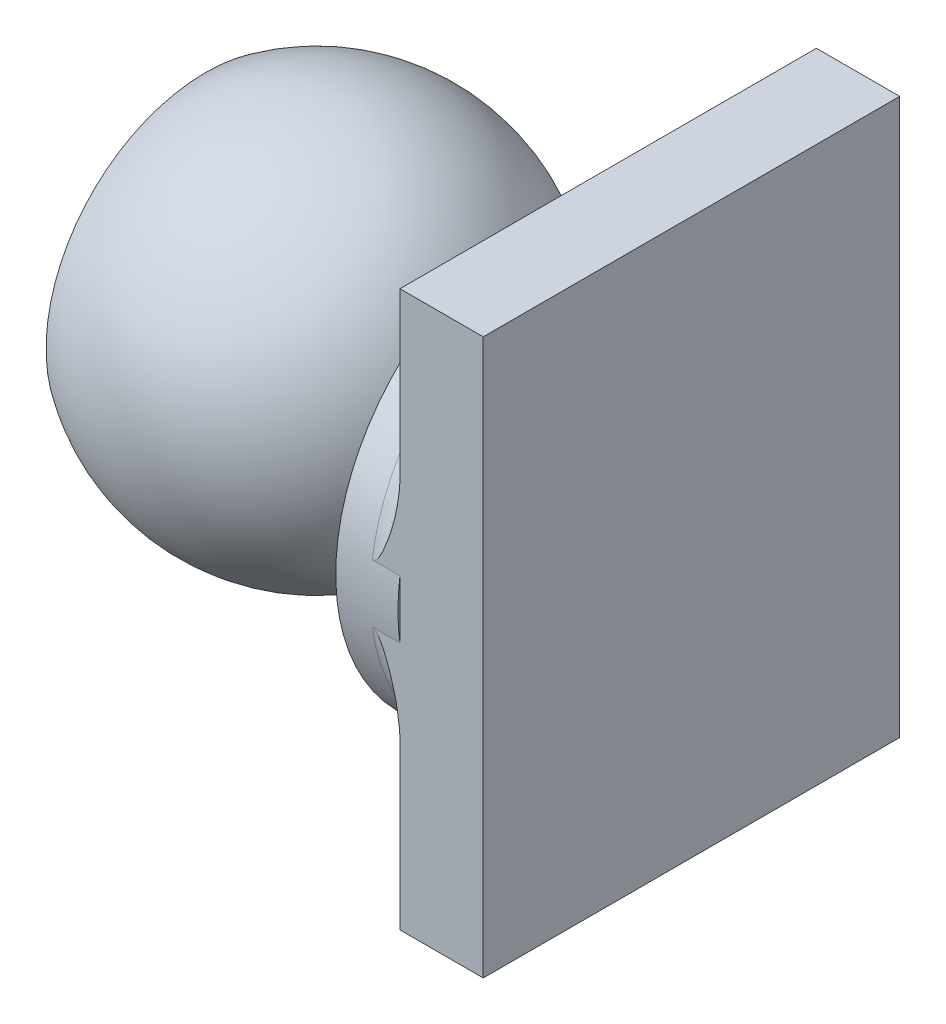
ISO-10303-21;
HEADER;
FILE_DESCRIPTION(('STEP AP214'),'2;1');
FILE_NAME('part.step','',(''),(''),'','','');
FILE_SCHEMA(('AUTOMOTIVE_DESIGN { 1 0 10303 214 1 1 1 1 }'));
ENDSEC;
DATA;
#1=APPLICATION_CONTEXT('core data for automotive mechanical design processes');
#2=APPLICATION_PROTOCOL_DEFINITION('international standard','automotive_design',2000,#1);
#3=PRODUCT_CONTEXT('',#1,'mechanical');
#4=PRODUCT('Part','Part','',(#3));
#5=PRODUCT_RELATED_PRODUCT_CATEGORY('part','',(#4));
#6=PRODUCT_DEFINITION_FORMATION('','',#4);
#7=PRODUCT_DEFINITION_CONTEXT('part definition',#1,'design');
#8=PRODUCT_DEFINITION('design','',#6,#7);
#9=PRODUCT_DEFINITION_SHAPE('','',#8);
#10=(LENGTH_UNIT() NAMED_UNIT(*) SI_UNIT(.MILLI.,.METRE.));
#11=(NAMED_UNIT(*) PLANE_ANGLE_UNIT() SI_UNIT($,.RADIAN.));
#12=(NAMED_UNIT(*) SI_UNIT($,.STERADIAN.) SOLID_ANGLE_UNIT());
#13=UNCERTAINTY_MEASURE_WITH_UNIT(LENGTH_MEASURE(1.E-05),#10,'distance_accuracy_value','');
#14=(GEOMETRIC_REPRESENTATION_CONTEXT(3) GLOBAL_UNCERTAINTY_ASSIGNED_CONTEXT((#13)) GLOBAL_UNIT_ASSIGNED_CONTEXT((#10,
#11,#12)) REPRESENTATION_CONTEXT('',''));
#15=CARTESIAN_POINT('',(0.,0.,0.));
#16=DIRECTION('',(0.,0.,1.));
#17=DIRECTION('',(1.,0.,0.));
#18=AXIS2_PLACEMENT_3D('',#15,#16,#17);
#19=CARTESIAN_POINT('',(3.5,0.,0.));
#20=DIRECTION('',(1.,0.,0.));
#21=DIRECTION('',(0.,1.,0.));
#22=AXIS2_PLACEMENT_3D('',#19,#20,#21);
#23=PLANE('',#22);
#24=DIRECTION('',(0.,1.,0.));
#25=VECTOR('',#24,1.);
#26=CARTESIAN_POINT('',(3.5,-10.,-7.5));
#27=LINE('',#26,#25);
#28=CARTESIAN_POINT('',(3.5,-1.04668366344204,-7.5));
#29=VERTEX_POINT('',#28);
#30=CARTESIAN_POINT('',(3.5,1.04668366344204,-7.5));
#31=VERTEX_POINT('',#30);
#32=EDGE_CURVE('E152',#29,#31,#27,.T.);
#33=ORIENTED_EDGE('',*,*,#32,.F.);
#34=CARTESIAN_POINT('',(3.5,0.,0.));
#35=DIRECTION('',(1.,0.,0.));
#36=DIRECTION('',(0.,1.,0.));
#37=AXIS2_PLACEMENT_3D('',#34,#35,#36);
#38=CIRCLE('',#37,7.57268424611224);
#39=EDGE_CURVE('E125',#29,#31,#38,.T.);
#40=ORIENTED_EDGE('',*,*,#39,.T.);
#41=EDGE_LOOP('',(#33,#40));
#42=FACE_BOUND('',#41,.T.);
#43=ADVANCED_FACE('F16',(#42),#23,.T.);
#44=CARTESIAN_POINT('',(-7.,0.,0.));
#45=DIRECTION('',(1.,0.,0.));
#46=DIRECTION('',(0.,-1.,0.));
#47=AXIS2_PLACEMENT_3D('',#44,#45,#46);
#48=SPHERICAL_SURFACE('',#47,7.);
#49=CARTESIAN_POINT('',(-0.625893910425168,0.,0.));
#50=DIRECTION('',(1.,0.,0.));
#51=DIRECTION('',(0.,1.,0.));
#52=AXIS2_PLACEMENT_3D('',#49,#50,#51);
#53=CIRCLE('',#52,2.89322857010037);
#54=CARTESIAN_POINT('',(-0.625893910425168,-2.89322857010037,0.));
#55=VERTEX_POINT('',#54);
#56=EDGE_CURVE('E144',#55,#55,#53,.T.);
#57=CARTESIAN_POINT('',(-11.,0.,0.));
#58=DIRECTION('',(1.,0.,0.));
#59=DIRECTION('',(0.,1.,0.));
#60=AXIS2_PLACEMENT_3D('',#57,#58,#59);
#61=CIRCLE('',#60,5.74456264653803);
#62=CARTESIAN_POINT('',(-11.,-5.74456264653803,0.));
#63=VERTEX_POINT('',#62);
#64=EDGE_CURVE('E141',#63,#63,#61,.T.);
#65=CARTESIAN_POINT('',(-0.625893910425168,-2.89322857010037,0.));
#66=CARTESIAN_POINT('',(-0.678720513837134,-3.00962059925854,0.));
#67=CARTESIAN_POINT('',(-0.734741613755756,-3.12456224260421,0.));
#68=CARTESIAN_POINT('',(-0.852990055992285,-3.35120758791202,0.));
#69=CARTESIAN_POINT('',(-0.915217398310191,-3.46291128987415,0.));
#70=CARTESIAN_POINT('',(-1.04569557473126,-3.68274358265632,0.));
#71=CARTESIAN_POINT('',(-1.11394640883443,-3.79087217347635,0.));
#72=CARTESIAN_POINT('',(-1.25626575846157,-4.00323040259294,0.));
#73=CARTESIAN_POINT('',(-1.33033427398554,-4.10746004088951,0.));
#74=CARTESIAN_POINT('',(-1.48406705952899,-4.31170752320604,0.));
#75=CARTESIAN_POINT('',(-1.56373132954847,-4.41172536722599,0.));
#76=CARTESIAN_POINT('',(-1.72841655141014,-4.60724924171603,0.));
#77=CARTESIAN_POINT('',(-1.81343750325235,-4.70275527218611,0.));
#78=CARTESIAN_POINT('',(-1.98858104173803,-4.88896898590638,0.));
#79=CARTESIAN_POINT('',(-2.07870362838151,-4.97967666915657,0.));
#80=CARTESIAN_POINT('',(-2.26378005856001,-5.1560215634769,0.));
#81=CARTESIAN_POINT('',(-2.35873390209502,-5.24165877454704,0.));
#82=CARTESIAN_POINT('',(-2.55318798101424,-5.40760580763381,0.));
#83=CARTESIAN_POINT('',(-2.65268821639844,-5.48791562965045,0.));
#84=CARTESIAN_POINT('',(-2.85593657271387,-5.64296695116595,0.));
#85=CARTESIAN_POINT('',(-2.9596846936451,-5.71770845066482,0.));
#86=CARTESIAN_POINT('',(-3.17111757136829,-5.86139889868131,0.));
#87=CARTESIAN_POINT('',(-3.27880232816025,-5.93034784719893,0.));
#88=CARTESIAN_POINT('',(-3.49778541767249,-6.0622463428146,0.));
#89=CARTESIAN_POINT('',(-3.60908375039277,-6.12519588991265,0.));
#90=CARTESIAN_POINT('',(-3.83496009094789,-6.24490673075047,0.));
#91=CARTESIAN_POINT('',(-3.94953809878274,-6.30166802449025,0.));
#92=CARTESIAN_POINT('',(-4.18163004954683,-6.40883207176162,0.));
#93=CARTESIAN_POINT('',(-4.29914399247606,-6.45923482529322,0.));
#94=CARTESIAN_POINT('',(-4.53675526545239,-6.55353058125031,0.));
#95=CARTESIAN_POINT('',(-4.65685259549947,-6.59742358367581,0.));
#96=CARTESIAN_POINT('',(-4.89927034443777,-6.67856815611704,0.));
#97=CARTESIAN_POINT('',(-5.02159076332898,-6.71581972613277,0.));
#98=CARTESIAN_POINT('',(-5.26808772229913,-6.7835696770954,0.));
#99=CARTESIAN_POINT('',(-5.39226426237807,-6.8140680580423,0.));
#100=CARTESIAN_POINT('',(-5.64210092760658,-6.86822013412881,0.));
#101=CARTESIAN_POINT('',(-5.76776105275615,-6.89187382926842,0.));
#102=CARTESIAN_POINT('',(-6.02018790117591,-6.93226557141724,0.));
#103=CARTESIAN_POINT('',(-6.14695462444609,-6.94900361842645,0.));
#104=CARTESIAN_POINT('',(-6.40121436230521,-6.97551384929822,0.));
#105=CARTESIAN_POINT('',(-6.52870737689414,-6.98528603316079,0.));
#106=CARTESIAN_POINT('',(-6.78403721167539,-6.99783522067448,0.));
#107=CARTESIAN_POINT('',(-6.91187403186771,-7.00061222432561,0.));
#108=CARTESIAN_POINT('',(-7.16750796071125,-6.9991627202674,0.));
#109=CARTESIAN_POINT('',(-7.29530506936247,-6.99493621255805,0.));
#110=CARTESIAN_POINT('',(-7.55047617709495,-6.97949236549626,0.));
#111=CARTESIAN_POINT('',(-7.67785017617622,-6.96827502614381,0.));
#112=CARTESIAN_POINT('',(-7.93179293616937,-6.93888316850108,0.));
#113=CARTESIAN_POINT('',(-8.05836169708125,-6.92070865021079,0.));
#114=CARTESIAN_POINT('',(-8.31031426759956,-6.87745695882374,0.));
#115=CARTESIAN_POINT('',(-8.43569807720598,-6.85237978572698,0.));
#116=CARTESIAN_POINT('',(-8.68490458798784,-6.79539801895556,0.));
#117=CARTESIAN_POINT('',(-8.80872728916329,-6.7634934252809,0.));
#118=CARTESIAN_POINT('',(-9.05444010527926,-6.69295252758927,0.));
#119=CARTESIAN_POINT('',(-9.17633022021979,-6.6543162235723,0.));
#120=CARTESIAN_POINT('',(-9.41781219916878,-6.57042783559098,0.));
#121=CARTESIAN_POINT('',(-9.53740406317724,-6.52517575162664,0.));
#122=CARTESIAN_POINT('',(-9.77393071353546,-6.42819148973891,0.));
#123=CARTESIAN_POINT('',(-9.89086549988521,-6.37645931181553,0.));
#124=CARTESIAN_POINT('',(-10.1217273519346,-6.26667033231316,0.));
#125=CARTESIAN_POINT('',(-10.2356544176342,-6.20861353073418,0.));
#126=CARTESIAN_POINT('',(-10.4601584161608,-6.08634846574174,0.));
#127=CARTESIAN_POINT('',(-10.5707353489877,-6.02214020232826,0.));
#128=CARTESIAN_POINT('',(-10.7882096779587,-5.88776861723792,0.));
#129=CARTESIAN_POINT('',(-10.8951070741027,-5.81760529556105,0.));
#130=CARTESIAN_POINT('',(-11.,-5.74456264653803,0.));
#131=B_SPLINE_CURVE_WITH_KNOTS('',3,(#65,#66,#67,#68,#69,#70,#71,#72,#73,#74,#75,#76,#77,#78,
#79,#80,#81,#82,#83,#84,#85,#86,#87,#88,#89,#90,#91,#92,#93,#94,#95,#96,#97,#98,#99,#100,#101,
#102,#103,#104,#105,#106,#107,#108,#109,#110,#111,#112,#113,#114,#115,#116,#117,#118,#119,#120,
#121,#122,#123,#124,#125,#126,#127,#128,#129,#130),.UNSPECIFIED.,.F.,.F.,(4,2,2,2,2,2,2,2,2,2,2,
2,2,2,2,2,2,2,2,2,2,2,2,2,2,2,2,2,2,2,2,2,4),(0.,0.383409133512161,0.766818267024323,
1.15022740053648,1.53363653404865,1.91704566756081,2.30045480107297,2.68386393458513,
3.06727306809729,3.45068220160945,3.83409133512161,4.21750046863378,4.60090960214594,
4.9843187356581,5.36772786917026,5.75113700268242,6.13454613619458,6.51795526970675,
6.90136440321891,7.28477353673107,7.66818267024323,8.05159180375539,8.43500093726755,
8.81841007077972,9.20181920429188,9.58522833780404,9.9686374713162,10.3520466048284,
10.7354557383405,11.1188648718527,11.5022740053648,11.885683138877,12.2690922723892),.UNSPECIFIED.);
#132=EDGE_CURVE('BSEAM188',#55,#63,#131,.T.);
#133=ORIENTED_EDGE('',*,*,#56,.F.);
#134=ORIENTED_EDGE('',*,*,#64,.T.);
#135=ORIENTED_EDGE('',*,*,#132,.T.);
#136=ORIENTED_EDGE('',*,*,#132,.F.);
#137=EDGE_LOOP('',(#133,#135,#134,#136));
#138=FACE_BOUND('',#137,.T.);
#139=ADVANCED_FACE('F188',(#138),#48,.T.);
#140=CARTESIAN_POINT('',(-11.,5.74456264653803,0.));
#141=DIRECTION('',(-1.,0.,0.));
#142=DIRECTION('',(0.,-1.,0.));
#143=AXIS2_PLACEMENT_3D('',#140,#141,#142);
#144=PLANE('',#143);
#145=CARTESIAN_POINT('',(-11.,0.,0.));
#146=DIRECTION('',(-1.,0.,0.));
#147=DIRECTION('',(0.,-1.,0.));
#148=AXIS2_PLACEMENT_3D('',#145,#146,#147);
#149=CIRCLE('',#148,5.1234753829798);
#150=CARTESIAN_POINT('',(-11.,-5.1234753829798,0.));
#151=VERTEX_POINT('',#150);
#152=EDGE_CURVE('E138',#151,#151,#149,.F.);
#153=ORIENTED_EDGE('',*,*,#152,.T.);
#154=EDGE_LOOP('',(#153));
#155=FACE_BOUND('',#154,.T.);
#156=ORIENTED_EDGE('',*,*,#64,.F.);
#157=EDGE_LOOP('',(#156));
#158=FACE_BOUND('',#157,.T.);
#159=ADVANCED_FACE('F192',(#155,#158),#144,.T.);
#160=CARTESIAN_POINT('',(-7.,0.,0.));
#161=DIRECTION('',(1.,0.,0.));
#162=DIRECTION('',(0.,-1.,0.));
#163=AXIS2_PLACEMENT_3D('',#160,#161,#162);
#164=SPHERICAL_SURFACE('',#163,6.5);
#165=ORIENTED_EDGE('',*,*,#152,.F.);
#166=EDGE_LOOP('',(#165));
#167=FACE_BOUND('',#166,.T.);
#168=ADVANCED_FACE('F196',(#167),#164,.F.);
#169=CARTESIAN_POINT('',(-11.5113796526032,0.,0.));
#170=DIRECTION('',(1.,0.,0.));
#171=DIRECTION('',(0.,1.,0.));
#172=AXIS2_PLACEMENT_3D('',#169,#170,#171);
#173=DEGENERATE_TOROIDAL_SURFACE('',#172,10.,13.,.T.);
#174=ORIENTED_EDGE('',*,*,#56,.T.);
#175=EDGE_LOOP('',(#174));
#176=FACE_BOUND('',#175,.T.);
#177=CARTESIAN_POINT('',(1.26,0.,0.));
#178=DIRECTION('',(1.,0.,0.));
#179=DIRECTION('',(0.,1.,0.));
#180=AXIS2_PLACEMENT_3D('',#177,#178,#179);
#181=CIRCLE('',#180,7.57268424611224);
#182=CARTESIAN_POINT('',(1.26,7.57268424611224,0.));
#183=VERTEX_POINT('',#182);
#184=EDGE_CURVE('E135',#183,#183,#181,.T.);
#185=ORIENTED_EDGE('',*,*,#184,.F.);
#186=EDGE_LOOP('',(#185));
#187=FACE_BOUND('',#186,.T.);
#188=ADVANCED_FACE('F200',(#176,#187),#173,.F.);
#189=CARTESIAN_POINT('',(-11.,0.,0.));
#190=DIRECTION('',(1.,0.,0.));
#191=DIRECTION('',(0.,1.,0.));
#192=AXIS2_PLACEMENT_3D('',#189,#190,#191);
#193=CYLINDRICAL_SURFACE('',#192,7.57268424611224);
#194=ORIENTED_EDGE('',*,*,#184,.T.);
#195=EDGE_LOOP('',(#194));
#196=FACE_BOUND('',#195,.T.);
#197=ORIENTED_EDGE('',*,*,#39,.F.);
#198=DIRECTION('',(1.,0.,0.));
#199=VECTOR('',#198,1.);
#200=CARTESIAN_POINT('',(3.5,-1.04668366344204,-7.5));
#201=LINE('',#200,#199);
#202=CARTESIAN_POINT('',(2.5,-1.04668366344204,-7.5));
#203=VERTEX_POINT('',#202);
#204=EDGE_CURVE('E45',#29,#203,#201,.F.);
#205=ORIENTED_EDGE('',*,*,#204,.T.);
#206=CARTESIAN_POINT('',(2.5,0.,0.));
#207=DIRECTION('',(-1.,0.,0.));
#208=DIRECTION('',(0.,-1.,0.));
#209=AXIS2_PLACEMENT_3D('',#206,#207,#208);
#210=CIRCLE('',#209,7.57268424611224);
#211=CARTESIAN_POINT('',(2.5,-1.04668366344206,7.5));
#212=VERTEX_POINT('',#211);
#213=EDGE_CURVE('E160',#203,#212,#210,.T.);
#214=ORIENTED_EDGE('',*,*,#213,.T.);
#215=DIRECTION('',(1.,0.,0.));
#216=VECTOR('',#215,1.);
#217=CARTESIAN_POINT('',(2.5,-1.04668366344206,7.5));
#218=LINE('',#217,#216);
#219=CARTESIAN_POINT('',(3.5,-1.04668366344206,7.5));
#220=VERTEX_POINT('',#219);
#221=EDGE_CURVE('E158',#212,#220,#218,.T.);
#222=ORIENTED_EDGE('',*,*,#221,.T.);
#223=CARTESIAN_POINT('',(3.5,1.04668366344206,7.5));
#224=VERTEX_POINT('',#223);
#225=EDGE_CURVE('E128',#224,#220,#38,.T.);
#226=ORIENTED_EDGE('',*,*,#225,.F.);
#227=DIRECTION('',(1.,0.,0.));
#228=VECTOR('',#227,1.);
#229=CARTESIAN_POINT('',(3.5,1.04668366344206,7.5));
#230=LINE('',#229,#228);
#231=CARTESIAN_POINT('',(2.5,1.04668366344206,7.5));
#232=VERTEX_POINT('',#231);
#233=EDGE_CURVE('E37',#224,#232,#230,.F.);
#234=ORIENTED_EDGE('',*,*,#233,.T.);
#235=CARTESIAN_POINT('',(2.5,0.,0.));
#236=DIRECTION('',(-1.,0.,0.));
#237=DIRECTION('',(0.,-1.,0.));
#238=AXIS2_PLACEMENT_3D('',#235,#236,#237);
#239=CIRCLE('',#238,7.57268424611224);
#240=CARTESIAN_POINT('',(2.5,1.04668366344204,-7.5));
#241=VERTEX_POINT('',#240);
#242=EDGE_CURVE('E154',#232,#241,#239,.T.);
#243=ORIENTED_EDGE('',*,*,#242,.T.);
#244=DIRECTION('',(1.,0.,0.));
#245=VECTOR('',#244,1.);
#246=CARTESIAN_POINT('',(2.5,1.04668366344204,-7.5));
#247=LINE('',#246,#245);
#248=EDGE_CURVE('E151',#241,#31,#247,.T.);
#249=ORIENTED_EDGE('',*,*,#248,.T.);
#250=EDGE_LOOP('',(#197,#205,#214,#222,#226,#234,#243,#249));
#251=FACE_BOUND('',#250,.T.);
#252=ADVANCED_FACE('F204',(#196,#251),#193,.T.);
#253=DIRECTION('',(0.,-1.,0.));
#254=VECTOR('',#253,1.);
#255=CARTESIAN_POINT('',(3.5,-10.,7.5));
#256=LINE('',#255,#254);
#257=EDGE_CURVE('E147',#224,#220,#256,.T.);
#258=ORIENTED_EDGE('',*,*,#257,.F.);
#259=ORIENTED_EDGE('',*,*,#225,.T.);
#260=EDGE_LOOP('',(#258,#259));
#261=FACE_BOUND('',#260,.T.);
#262=ADVANCED_FACE('F207',(#261),#23,.T.);
#263=CARTESIAN_POINT('',(3.5,0.,0.));
#264=DIRECTION('',(-1.,0.,0.));
#265=DIRECTION('',(0.,-1.,0.));
#266=AXIS2_PLACEMENT_3D('',#263,#264,#265);
#267=PLANE('',#266);
#268=CARTESIAN_POINT('',(3.5,-4.15221810404282,7.5));
#269=VERTEX_POINT('',#268);
#270=CARTESIAN_POINT('',(3.5,-10.,7.5));
#271=VERTEX_POINT('',#270);
#272=EDGE_CURVE('E231',#269,#271,#256,.T.);
#273=ORIENTED_EDGE('',*,*,#272,.F.);
#274=CARTESIAN_POINT('',(3.5,0.,0.));
#275=DIRECTION('',(-1.,0.,0.));
#276=DIRECTION('',(0.,-1.,0.));
#277=AXIS2_PLACEMENT_3D('',#274,#275,#276);
#278=CIRCLE('',#277,8.57268424611224);
#279=CARTESIAN_POINT('',(3.5,-4.15221810404281,-7.5));
#280=VERTEX_POINT('',#279);
#281=EDGE_CURVE('E148',#269,#280,#278,.F.);
#282=ORIENTED_EDGE('',*,*,#281,.T.);
#283=CARTESIAN_POINT('',(3.5,-10.,-7.5));
#284=VERTEX_POINT('',#283);
#285=EDGE_CURVE('E228',#284,#280,#27,.T.);
#286=ORIENTED_EDGE('',*,*,#285,.F.);
#287=DIRECTION('',(0.,0.,-1.));
#288=VECTOR('',#287,1.);
#289=CARTESIAN_POINT('',(3.5,-10.,7.5));
#290=LINE('',#289,#288);
#291=EDGE_CURVE('E118',#271,#284,#290,.T.);
#292=ORIENTED_EDGE('',*,*,#291,.F.);
#293=EDGE_LOOP('',(#273,#282,#286,#292));
#294=FACE_BOUND('',#293,.T.);
#295=ADVANCED_FACE('F210',(#294),#267,.T.);
#296=CARTESIAN_POINT('',(6.5,-10.,-7.5));
#297=DIRECTION('',(0.,0.,1.));
#298=DIRECTION('',(1.,0.,0.));
#299=AXIS2_PLACEMENT_3D('',#296,#297,#298);
#300=PLANE('',#299);
#301=ORIENTED_EDGE('',*,*,#285,.T.);
#302=CARTESIAN_POINT('',(3.5,-4.15221810404281,-7.5));
#303=CARTESIAN_POINT('',(3.49998602585192,-4.07619579044968,-7.5));
#304=CARTESIAN_POINT('',(3.49796690258575,-4.00019552069111,-7.5));
#305=CARTESIAN_POINT('',(3.49032557481961,-3.84841051982147,-7.5));
#306=CARTESIAN_POINT('',(3.48470513667468,-3.77262570133002,-7.5));
#307=CARTESIAN_POINT('',(3.47027829481186,-3.62148045349341,-7.5));
#308=CARTESIAN_POINT('',(3.46147662918391,-3.54611956139317,-7.5));
#309=CARTESIAN_POINT('',(3.44100197833614,-3.39578328651817,-7.5));
#310=CARTESIAN_POINT('',(3.42932859895472,-3.320807958108,-7.5));
#311=CARTESIAN_POINT('',(3.39049919530744,-3.09702986013956,-7.5));
#312=CARTESIAN_POINT('',(3.35948390541665,-2.94888941892457,-7.5));
#313=CARTESIAN_POINT('',(3.28873234310775,-2.65470467569145,-7.5));
#314=CARTESIAN_POINT('',(3.24899431701207,-2.50866080148067,-7.5));
#315=CARTESIAN_POINT('',(3.18077945003938,-2.28297239525335,-7.5));
#316=CARTESIAN_POINT('',(3.15507643986649,-2.20247927776013,-7.5));
#317=CARTESIAN_POINT('',(3.10107093080022,-2.04237821522817,-7.5));
#318=CARTESIAN_POINT('',(3.07276888945103,-1.96277011714274,-7.5));
#319=CARTESIAN_POINT('',(3.0227135749947,-1.8299120681365,-7.5));
#320=CARTESIAN_POINT('',(3.00175488675105,-1.77636250834128,-7.5));
#321=CARTESIAN_POINT('',(2.95820216839895,-1.66993571322519,-7.5));
#322=CARTESIAN_POINT('',(2.93560835781915,-1.61705838876776,-7.5));
#323=CARTESIAN_POINT('',(2.89592758732802,-1.52921711396469,-7.5));
#324=CARTESIAN_POINT('',(2.8794240668085,-1.49399265591849,-7.5));
#325=CARTESIAN_POINT('',(2.84513583041643,-1.42422341561753,-7.5));
#326=CARTESIAN_POINT('',(2.82735231162264,-1.38967803580789,-7.5));
#327=CARTESIAN_POINT('',(2.78332606571215,-1.3092317541726,-7.5));
#328=CARTESIAN_POINT('',(2.75633849892161,-1.26370664537015,-7.5));
#329=CARTESIAN_POINT('',(2.71077234488167,-1.19785827797504,-7.5));
#330=CARTESIAN_POINT('',(2.69443735223194,-1.17599284903538,-7.5));
#331=CARTESIAN_POINT('',(2.65922573376918,-1.13439156076557,-7.5));
#332=CARTESIAN_POINT('',(2.64036122730068,-1.11464630924515,-7.5));
#333=CARTESIAN_POINT('',(2.61113868826713,-1.09038536858632,-7.5));
#334=CARTESIAN_POINT('',(2.60248702284684,-1.08385164670882,-7.5));
#335=CARTESIAN_POINT('',(2.58441635762723,-1.07192642457945,-7.5));
#336=CARTESIAN_POINT('',(2.57499806004413,-1.06653389496831,-7.5));
#337=CARTESIAN_POINT('',(2.55729044222762,-1.05828321289377,-7.5));
#338=CARTESIAN_POINT('',(2.54913831372899,-1.05513604215696,-7.5));
#339=CARTESIAN_POINT('',(2.53243397061373,-1.05023788940225,-7.5));
#340=CARTESIAN_POINT('',(2.52388307951087,-1.04848259446262,-7.5));
#341=CARTESIAN_POINT('',(2.51018620323898,-1.04696278890831,-7.5));
#342=CARTESIAN_POINT('',(2.50509419622608,-1.04667523440866,-7.5));
#343=CARTESIAN_POINT('',(2.5,-1.04668366344208,-7.5));
#344=B_SPLINE_CURVE_WITH_KNOTS('',3,(#302,#303,#304,#305,#306,#307,#308,#309,#310,#311,#312,
#313,#314,#315,#316,#317,#318,#319,#320,#321,#322,#323,#324,#325,#326,#327,#328,#329,#330,#331,
#332,#333,#334,#335,#336,#337,#338,#339,#340,#341,#342,#343),.UNSPECIFIED.,.F.,.F.,(4,2,2,2,2,2,
2,2,2,2,2,2,2,2,2,2,2,2,2,2,4),(0.,0.228008865198607,0.455905983256454,0.683465062855094,
0.911055393877772,1.36477511347286,1.81858613561742,2.07204304792123,2.32545542584803,
2.49795008782082,2.67042163377484,2.78709082771679,2.90365229368714,3.06206090625099,
3.14387544414527,3.22531113784945,3.25777594791488,3.29021134860758,3.31633190961825,
3.34237121263808,3.35764428545047),.UNSPECIFIED.);
#345=EDGE_CURVE('E167',#280,#203,#344,.T.);
#346=ORIENTED_EDGE('',*,*,#345,.T.);
#347=ORIENTED_EDGE('',*,*,#204,.F.);
#348=ORIENTED_EDGE('',*,*,#32,.T.);
#349=ORIENTED_EDGE('',*,*,#248,.F.);
#350=CARTESIAN_POINT('',(2.5,1.04668366344204,-7.5));
#351=CARTESIAN_POINT('',(2.50916212348161,1.04665001558555,-7.5));
#352=CARTESIAN_POINT('',(2.51827265365203,1.04759325552513,-7.5));
#353=CARTESIAN_POINT('',(2.53602510694833,1.05110080177459,-7.5));
#354=CARTESIAN_POINT('',(2.54467232725173,1.05363764923506,-7.5));
#355=CARTESIAN_POINT('',(2.56430804357991,1.0611042716994,-7.5));
#356=CARTESIAN_POINT('',(2.57509261561134,1.06655444645507,-7.5));
#357=CARTESIAN_POINT('',(2.59575117114504,1.0790628045957,-7.5));
#358=CARTESIAN_POINT('',(2.60561761228421,1.08613289258697,-7.5));
#359=CARTESIAN_POINT('',(2.63908559131765,1.11295152545352,-7.5));
#360=CARTESIAN_POINT('',(2.66042210123204,1.13544773387831,-7.5));
#361=CARTESIAN_POINT('',(2.70000575914009,1.18298576511521,-7.5));
#362=CARTESIAN_POINT('',(2.71823154176116,1.20804343983578,-7.5));
#363=CARTESIAN_POINT('',(2.75358406895373,1.26081344015133,-7.5));
#364=CARTESIAN_POINT('',(2.77060656445203,1.28859600256456,-7.5));
#365=CARTESIAN_POINT('',(2.80317795473258,1.345018908314,-7.5));
#366=CARTESIAN_POINT('',(2.81872554780449,1.37365998054827,-7.5));
#367=CARTESIAN_POINT('',(2.86384644506877,1.46052711897878,-7.5));
#368=CARTESIAN_POINT('',(2.89182508723849,1.51957895144373,-7.5));
#369=CARTESIAN_POINT('',(2.9452037648885,1.63900509513721,-7.5));
#370=CARTESIAN_POINT('',(2.97059618977094,1.69938270812543,-7.5));
#371=CARTESIAN_POINT('',(3.01932490224354,1.82087505152409,-7.5));
#372=CARTESIAN_POINT('',(3.04266365304079,1.88198879610447,-7.5));
#373=CARTESIAN_POINT('',(3.09816405710966,2.03355710302849,-7.5));
#374=CARTESIAN_POINT('',(3.12934836063497,2.1243690829884,-7.5));
#375=CARTESIAN_POINT('',(3.18843748693465,2.30706372279117,-7.5));
#376=CARTESIAN_POINT('',(3.21634183579313,2.3989465352541,-7.5));
#377=CARTESIAN_POINT('',(3.26886941224846,2.58370423234554,-7.5));
#378=CARTESIAN_POINT('',(3.29349074204254,2.67657965755368,-7.5));
#379=CARTESIAN_POINT('',(3.3392275988728,2.86318885427796,-7.5));
#380=CARTESIAN_POINT('',(3.36034327426913,2.95692258929299,-7.5));
#381=CARTESIAN_POINT('',(3.39799910860471,3.14163273997226,-7.5));
#382=CARTESIAN_POINT('',(3.41468171503674,3.23257993860565,-7.5));
#383=CARTESIAN_POINT('',(3.44405525822699,3.41510197449994,-7.5));
#384=CARTESIAN_POINT('',(3.45674704254346,3.50667667426713,-7.5));
#385=CARTESIAN_POINT('',(3.47762686508688,3.69038215708517,-7.5));
#386=CARTESIAN_POINT('',(3.48581348970603,3.78251310551615,-7.5));
#387=CARTESIAN_POINT('',(3.49698723893784,3.96715368266706,-7.5));
#388=CARTESIAN_POINT('',(3.49997040570137,4.05966354603787,-7.5));
#389=CARTESIAN_POINT('',(3.5,4.15221810404281,-7.5));
#390=B_SPLINE_CURVE_WITH_KNOTS('',3,(#350,#351,#352,#353,#354,#355,#356,#357,#358,#359,#360,
#361,#362,#363,#364,#365,#366,#367,#368,#369,#370,#371,#372,#373,#374,#375,#376,#377,#378,#379,
#380,#381,#382,#383,#384,#385,#386,#387,#388,#389),.UNSPECIFIED.,.F.,.F.,(4,2,2,2,2,2,2,2,2,2,2,
2,2,2,2,2,2,2,2,4),(0.,0.027355378285729,0.0542518695588779,0.090295744335143,0.126613518122659,
0.218899511780234,0.311795856733867,0.409454773965798,0.507199095775759,0.703102891230315,
0.899567467152857,1.09579309380254,1.38377271708995,1.67179389912061,1.95998086129607,
2.24815562421911,2.5254698667869,2.80272517438682,3.08006742831985,3.35762054221317),.UNSPECIFIED.);
#391=CARTESIAN_POINT('',(3.5,4.15221810404281,-7.5));
#392=VERTEX_POINT('',#391);
#393=EDGE_CURVE('E10',#241,#392,#390,.T.);
#394=ORIENTED_EDGE('',*,*,#393,.T.);
#395=CARTESIAN_POINT('',(3.5,10.,-7.5));
#396=VERTEX_POINT('',#395);
#397=EDGE_CURVE('E123',#392,#396,#27,.T.);
#398=ORIENTED_EDGE('',*,*,#397,.T.);
#399=DIRECTION('',(-1.,0.,0.));
#400=VECTOR('',#399,1.);
#401=CARTESIAN_POINT('',(6.5,10.,-7.5));
#402=LINE('',#401,#400);
#403=CARTESIAN_POINT('',(6.5,10.,-7.5));
#404=VERTEX_POINT('',#403);
#405=EDGE_CURVE('E104',#404,#396,#402,.T.);
#406=ORIENTED_EDGE('',*,*,#405,.F.);
#407=DIRECTION('',(0.,1.,0.));
#408=VECTOR('',#407,1.);
#409=CARTESIAN_POINT('',(6.5,-10.,-7.5));
#410=LINE('',#409,#408);
#411=CARTESIAN_POINT('',(6.5,-10.,-7.5));
#412=VERTEX_POINT('',#411);
#413=EDGE_CURVE('E110',#412,#404,#410,.T.);
#414=ORIENTED_EDGE('',*,*,#413,.F.);
#415=DIRECTION('',(-1.,0.,0.));
#416=VECTOR('',#415,1.);
#417=CARTESIAN_POINT('',(6.5,-10.,-7.5));
#418=LINE('',#417,#416);
#419=EDGE_CURVE('E239',#412,#284,#418,.T.);
#420=ORIENTED_EDGE('',*,*,#419,.T.);
#421=EDGE_LOOP('',(#301,#346,#347,#348,#349,#394,#398,#406,#414,#420));
#422=FACE_BOUND('',#421,.T.);
#423=ADVANCED_FACE('F121',(#422),#300,.F.);
#424=CARTESIAN_POINT('',(6.5,10.,7.5));
#425=DIRECTION('',(0.,-1.,0.));
#426=DIRECTION('',(1.,0.,0.));
#427=AXIS2_PLACEMENT_3D('',#424,#425,#426);
#428=PLANE('',#427);
#429=DIRECTION('',(0.,0.,1.));
#430=VECTOR('',#429,1.);
#431=CARTESIAN_POINT('',(3.5,10.,7.5));
#432=LINE('',#431,#430);
#433=CARTESIAN_POINT('',(3.5,10.,7.5));
#434=VERTEX_POINT('',#433);
#435=EDGE_CURVE('E234',#396,#434,#432,.T.);
#436=ORIENTED_EDGE('',*,*,#435,.T.);
#437=DIRECTION('',(-1.,0.,0.));
#438=VECTOR('',#437,1.);
#439=CARTESIAN_POINT('',(6.5,10.,7.5));
#440=LINE('',#439,#438);
#441=CARTESIAN_POINT('',(6.5,10.,7.5));
#442=VERTEX_POINT('',#441);
#443=EDGE_CURVE('E106',#442,#434,#440,.T.);
#444=ORIENTED_EDGE('',*,*,#443,.F.);
#445=DIRECTION('',(0.,0.,1.));
#446=VECTOR('',#445,1.);
#447=CARTESIAN_POINT('',(6.5,10.,7.5));
#448=LINE('',#447,#446);
#449=EDGE_CURVE('E100',#404,#442,#448,.T.);
#450=ORIENTED_EDGE('',*,*,#449,.F.);
#451=ORIENTED_EDGE('',*,*,#405,.T.);
#452=EDGE_LOOP('',(#436,#444,#450,#451));
#453=FACE_BOUND('',#452,.T.);
#454=ADVANCED_FACE('F102',(#453),#428,.F.);
#455=CARTESIAN_POINT('',(6.5,-10.,7.5));
#456=DIRECTION('',(0.,0.,-1.));
#457=DIRECTION('',(0.,1.,0.));
#458=AXIS2_PLACEMENT_3D('',#455,#456,#457);
#459=PLANE('',#458);
#460=CARTESIAN_POINT('',(3.5,4.15221810404282,7.5));
#461=VERTEX_POINT('',#460);
#462=EDGE_CURVE('E230',#434,#461,#256,.T.);
#463=ORIENTED_EDGE('',*,*,#462,.T.);
#464=CARTESIAN_POINT('',(3.5,4.15221810404282,7.5));
#465=CARTESIAN_POINT('',(3.49998602585192,4.07619579044968,7.5));
#466=CARTESIAN_POINT('',(3.49796690258575,4.00019552069112,7.5));
#467=CARTESIAN_POINT('',(3.49032557481961,3.84841051982148,7.5));
#468=CARTESIAN_POINT('',(3.48470513667468,3.77262570133002,7.5));
#469=CARTESIAN_POINT('',(3.47027829481186,3.62148045349341,7.5));
#470=CARTESIAN_POINT('',(3.46147662918391,3.54611956139317,7.5));
#471=CARTESIAN_POINT('',(3.44100197833614,3.39578328651818,7.5));
#472=CARTESIAN_POINT('',(3.42932859895472,3.320807958108,7.5));
#473=CARTESIAN_POINT('',(3.39049919530745,3.09702986013956,7.5));
#474=CARTESIAN_POINT('',(3.35948390541665,2.94888941892457,7.50000000000001));
#475=CARTESIAN_POINT('',(3.28873234310775,2.65470467569145,7.5));
#476=CARTESIAN_POINT('',(3.24899431701207,2.50866080148067,7.5));
#477=CARTESIAN_POINT('',(3.18077945003938,2.28297239525335,7.5));
#478=CARTESIAN_POINT('',(3.15507643986649,2.20247927776013,7.5));
#479=CARTESIAN_POINT('',(3.10107093080022,2.04237821522817,7.5));
#480=CARTESIAN_POINT('',(3.07276888945102,1.96277011714274,7.5));
#481=CARTESIAN_POINT('',(3.0227135749947,1.82991206813649,7.5));
#482=CARTESIAN_POINT('',(3.00175488675106,1.77636250834128,7.5));
#483=CARTESIAN_POINT('',(2.95820216839896,1.66993571322519,7.5));
#484=CARTESIAN_POINT('',(2.93560835781914,1.61705838876776,7.5));
#485=CARTESIAN_POINT('',(2.89592758732802,1.52921711396469,7.5));
#486=CARTESIAN_POINT('',(2.8794240668085,1.49399265591849,7.5));
#487=CARTESIAN_POINT('',(2.84513583041644,1.42422341561753,7.5));
#488=CARTESIAN_POINT('',(2.82735231162264,1.38967803580788,7.5));
#489=CARTESIAN_POINT('',(2.78332606571214,1.30923175417261,7.5));
#490=CARTESIAN_POINT('',(2.75633849892159,1.26370664537018,7.5));
#491=CARTESIAN_POINT('',(2.71077234488168,1.19785827797504,7.5));
#492=CARTESIAN_POINT('',(2.69443735223196,1.17599284903537,7.5));
#493=CARTESIAN_POINT('',(2.65922573376919,1.13439156076557,7.5));
#494=CARTESIAN_POINT('',(2.64036122730066,1.11464630924518,7.5));
#495=CARTESIAN_POINT('',(2.61113868826712,1.09038536858632,7.5));
#496=CARTESIAN_POINT('',(2.60248702284684,1.08385164670881,7.5));
#497=CARTESIAN_POINT('',(2.58441635762724,1.07192642457945,7.5));
#498=CARTESIAN_POINT('',(2.57499806004412,1.06653389496832,7.5));
#499=CARTESIAN_POINT('',(2.55729044222762,1.05828321289378,7.5));
#500=CARTESIAN_POINT('',(2.54913831372899,1.05513604215694,7.5));
#501=CARTESIAN_POINT('',(2.53243397061374,1.05023788940224,7.5));
#502=CARTESIAN_POINT('',(2.52388307951087,1.04848259446262,7.5));
#503=CARTESIAN_POINT('',(2.51018620323898,1.04696278890833,7.5));
#504=CARTESIAN_POINT('',(2.50509419622608,1.04667523440869,7.5));
#505=CARTESIAN_POINT('',(2.5,1.0466836634421,7.5));
#506=B_SPLINE_CURVE_WITH_KNOTS('',3,(#464,#465,#466,#467,#468,#469,#470,#471,#472,#473,#474,
#475,#476,#477,#478,#479,#480,#481,#482,#483,#484,#485,#486,#487,#488,#489,#490,#491,#492,#493,
#494,#495,#496,#497,#498,#499,#500,#501,#502,#503,#504,#505),.UNSPECIFIED.,.F.,.F.,(4,2,2,2,2,2,
2,2,2,2,2,2,2,2,2,2,2,2,2,2,4),(0.,0.228008865198607,0.455905983256455,0.683465062855095,
0.911055393877774,1.36477511347287,1.81858613561743,2.07204304792123,2.32545542584803,
2.49795008782083,2.67042163377485,2.7870908277168,2.90365229368714,3.06206090625099,
3.14387544414527,3.22531113784946,3.25777594791488,3.29021134860758,3.31633190961825,
3.34237121263808,3.35764428545047),.UNSPECIFIED.);
#507=EDGE_CURVE('E30',#461,#232,#506,.T.);
#508=ORIENTED_EDGE('',*,*,#507,.T.);
#509=ORIENTED_EDGE('',*,*,#233,.F.);
#510=ORIENTED_EDGE('',*,*,#257,.T.);
#511=ORIENTED_EDGE('',*,*,#221,.F.);
#512=CARTESIAN_POINT('',(2.5,-1.04668366344206,7.5));
#513=CARTESIAN_POINT('',(2.50916212348162,-1.04665001558553,7.5));
#514=CARTESIAN_POINT('',(2.51827265365204,-1.04759325552511,7.5));
#515=CARTESIAN_POINT('',(2.53602510694834,-1.05110080177459,7.5));
#516=CARTESIAN_POINT('',(2.54467232725173,-1.05363764923508,7.5));
#517=CARTESIAN_POINT('',(2.56430804357992,-1.06110427169942,7.5));
#518=CARTESIAN_POINT('',(2.57509261561136,-1.06655444645506,7.5));
#519=CARTESIAN_POINT('',(2.59575117114506,-1.07906280459569,7.5));
#520=CARTESIAN_POINT('',(2.60561761228422,-1.08613289258699,7.5));
#521=CARTESIAN_POINT('',(2.63908559131764,-1.11295152545358,7.5));
#522=CARTESIAN_POINT('',(2.66042210123205,-1.13544773387833,7.5));
#523=CARTESIAN_POINT('',(2.70000575914012,-1.18298576511522,7.5));
#524=CARTESIAN_POINT('',(2.71823154176117,-1.20804343983581,7.5));
#525=CARTESIAN_POINT('',(2.75358406895374,-1.26081344015138,7.5));
#526=CARTESIAN_POINT('',(2.77060656445206,-1.2885960025646,7.5));
#527=CARTESIAN_POINT('',(2.80317795473261,-1.34501890831404,7.5));
#528=CARTESIAN_POINT('',(2.81872554780452,-1.37365998054832,7.5));
#529=CARTESIAN_POINT('',(2.86384644506879,-1.46052711897884,7.5));
#530=CARTESIAN_POINT('',(2.89182508723852,-1.51957895144379,7.5));
#531=CARTESIAN_POINT('',(2.94520376488854,-1.63900509513727,7.5));
#532=CARTESIAN_POINT('',(2.97059618977098,-1.6993827081255,7.5));
#533=CARTESIAN_POINT('',(3.01932490224358,-1.82087505152417,7.5));
#534=CARTESIAN_POINT('',(3.04266365304082,-1.88198879610457,7.5));
#535=CARTESIAN_POINT('',(3.09816405710969,-2.03355710302859,7.5));
#536=CARTESIAN_POINT('',(3.129348360635,-2.1243690829885,7.5));
#537=CARTESIAN_POINT('',(3.18843748693469,-2.30706372279126,7.5));
#538=CARTESIAN_POINT('',(3.21634183579316,-2.39894653525419,7.5));
#539=CARTESIAN_POINT('',(3.26886941224848,-2.58370423234562,7.5));
#540=CARTESIAN_POINT('',(3.29349074204256,-2.67657965755376,7.5));
#541=CARTESIAN_POINT('',(3.33922759887282,-2.86318885427803,7.5));
#542=CARTESIAN_POINT('',(3.36034327426915,-2.95692258929306,7.5));
#543=CARTESIAN_POINT('',(3.39799910860472,-3.14163273997232,7.5));
#544=CARTESIAN_POINT('',(3.41468171503675,-3.2325799386057,7.5));
#545=CARTESIAN_POINT('',(3.444055258227,-3.41510197449998,7.5));
#546=CARTESIAN_POINT('',(3.45674704254347,-3.50667667426717,7.5));
#547=CARTESIAN_POINT('',(3.47762686508688,-3.6903821570852,7.5));
#548=CARTESIAN_POINT('',(3.48581348970604,-3.78251310551617,7.5));
#549=CARTESIAN_POINT('',(3.49698723893785,-3.96715368266707,7.5));
#550=CARTESIAN_POINT('',(3.49997040570138,-4.05966354603788,7.5));
#551=CARTESIAN_POINT('',(3.5,-4.15221810404282,7.5));
#552=B_SPLINE_CURVE_WITH_KNOTS('',3,(#512,#513,#514,#515,#516,#517,#518,#519,#520,#521,#522,
#523,#524,#525,#526,#527,#528,#529,#530,#531,#532,#533,#534,#535,#536,#537,#538,#539,#540,#541,
#542,#543,#544,#545,#546,#547,#548,#549,#550,#551),.UNSPECIFIED.,.F.,.F.,(4,2,2,2,2,2,2,2,2,2,2,
2,2,2,2,2,2,2,2,4),(0.,0.0273553782857323,0.0542518695588836,0.0902957443351544,
0.126613518122676,0.21889951178026,0.311795856733903,0.409454773965848,0.507199095775818,
0.703102891230381,0.899567467152938,1.09579309380264,1.38377271709004,1.6717938991207,
1.95998086129615,2.24815562421918,2.52546986678694,2.80272517438685,3.08006742831987,
3.35762054221318),.UNSPECIFIED.);
#553=EDGE_CURVE('E173',#212,#269,#552,.T.);
#554=ORIENTED_EDGE('',*,*,#553,.T.);
#555=ORIENTED_EDGE('',*,*,#272,.T.);
#556=DIRECTION('',(-1.,0.,0.));
#557=VECTOR('',#556,1.);
#558=CARTESIAN_POINT('',(6.5,-10.,7.5));
#559=LINE('',#558,#557);
#560=CARTESIAN_POINT('',(6.5,-10.,7.5));
#561=VERTEX_POINT('',#560);
#562=EDGE_CURVE('E130',#561,#271,#559,.T.);
#563=ORIENTED_EDGE('',*,*,#562,.F.);
#564=DIRECTION('',(0.,-1.,0.));
#565=VECTOR('',#564,1.);
#566=CARTESIAN_POINT('',(6.5,-10.,7.5));
#567=LINE('',#566,#565);
#568=EDGE_CURVE('E109',#442,#561,#567,.T.);
#569=ORIENTED_EDGE('',*,*,#568,.F.);
#570=ORIENTED_EDGE('',*,*,#443,.T.);
#571=EDGE_LOOP('',(#463,#508,#509,#510,#511,#554,#555,#563,#569,#570));
#572=FACE_BOUND('',#571,.T.);
#573=ADVANCED_FACE('F260',(#572),#459,.F.);
#574=CARTESIAN_POINT('',(6.5,-10.,7.5));
#575=DIRECTION('',(0.,1.,0.));
#576=DIRECTION('',(-1.,0.,0.));
#577=AXIS2_PLACEMENT_3D('',#574,#575,#576);
#578=PLANE('',#577);
#579=ORIENTED_EDGE('',*,*,#291,.T.);
#580=ORIENTED_EDGE('',*,*,#419,.F.);
#581=DIRECTION('',(0.,0.,-1.));
#582=VECTOR('',#581,1.);
#583=CARTESIAN_POINT('',(6.5,-10.,7.5));
#584=LINE('',#583,#582);
#585=EDGE_CURVE('E115',#561,#412,#584,.T.);
#586=ORIENTED_EDGE('',*,*,#585,.F.);
#587=ORIENTED_EDGE('',*,*,#562,.T.);
#588=EDGE_LOOP('',(#579,#580,#586,#587));
#589=FACE_BOUND('',#588,.T.);
#590=ADVANCED_FACE('F244',(#589),#578,.F.);
#591=CARTESIAN_POINT('',(6.5,0.,0.));
#592=DIRECTION('',(-1.,0.,0.));
#593=DIRECTION('',(0.,-1.,0.));
#594=AXIS2_PLACEMENT_3D('',#591,#592,#593);
#595=PLANE('',#594);
#596=ORIENTED_EDGE('',*,*,#413,.T.);
#597=ORIENTED_EDGE('',*,*,#449,.T.);
#598=ORIENTED_EDGE('',*,*,#568,.T.);
#599=ORIENTED_EDGE('',*,*,#585,.T.);
#600=EDGE_LOOP('',(#596,#597,#598,#599));
#601=FACE_BOUND('',#600,.T.);
#602=ADVANCED_FACE('F113',(#601),#595,.F.);
#603=ORIENTED_EDGE('',*,*,#397,.F.);
#604=CARTESIAN_POINT('',(3.5,0.,0.));
#605=DIRECTION('',(-1.,0.,0.));
#606=DIRECTION('',(0.,-1.,0.));
#607=AXIS2_PLACEMENT_3D('',#604,#605,#606);
#608=CIRCLE('',#607,8.57268424611224);
#609=EDGE_CURVE('E164',#392,#461,#608,.F.);
#610=ORIENTED_EDGE('',*,*,#609,.T.);
#611=ORIENTED_EDGE('',*,*,#462,.F.);
#612=ORIENTED_EDGE('',*,*,#435,.F.);
#613=EDGE_LOOP('',(#603,#610,#611,#612));
#614=FACE_BOUND('',#613,.T.);
#615=ADVANCED_FACE('F186',(#614),#267,.T.);
#616=CARTESIAN_POINT('',(2.5,0.,0.));
#617=DIRECTION('',(-1.,0.,0.));
#618=DIRECTION('',(0.,-1.,0.));
#619=AXIS2_PLACEMENT_3D('',#616,#617,#618);
#620=TOROIDAL_SURFACE('',#619,8.57268424611224,1.);
#621=ORIENTED_EDGE('',*,*,#553,.F.);
#622=ORIENTED_EDGE('',*,*,#213,.F.);
#623=ORIENTED_EDGE('',*,*,#345,.F.);
#624=ORIENTED_EDGE('',*,*,#281,.F.);
#625=EDGE_LOOP('',(#621,#622,#623,#624));
#626=FACE_BOUND('',#625,.T.);
#627=ADVANCED_FACE('F182',(#626),#620,.F.);
#628=CARTESIAN_POINT('',(2.5,0.,0.));
#629=DIRECTION('',(-1.,0.,0.));
#630=DIRECTION('',(0.,-1.,0.));
#631=AXIS2_PLACEMENT_3D('',#628,#629,#630);
#632=TOROIDAL_SURFACE('',#631,8.57268424611224,1.);
#633=ORIENTED_EDGE('',*,*,#393,.F.);
#634=ORIENTED_EDGE('',*,*,#242,.F.);
#635=ORIENTED_EDGE('',*,*,#507,.F.);
#636=ORIENTED_EDGE('',*,*,#609,.F.);
#637=EDGE_LOOP('',(#633,#634,#635,#636));
#638=FACE_BOUND('',#637,.T.);
#639=ADVANCED_FACE('F18',(#638),#632,.F.);
#640=CLOSED_SHELL('',(#43,#139,#159,#168,#188,#252,#262,#295,#423,#454,#573,#590,#602,#615,#627,#639));
#641=MANIFOLD_SOLID_BREP('B1',#640);
#642=ADVANCED_BREP_SHAPE_REPRESENTATION('',(#18,#641),#14);
#643=SHAPE_DEFINITION_REPRESENTATION(#9,#642);
ENDSEC;
END-ISO-10303-21;
